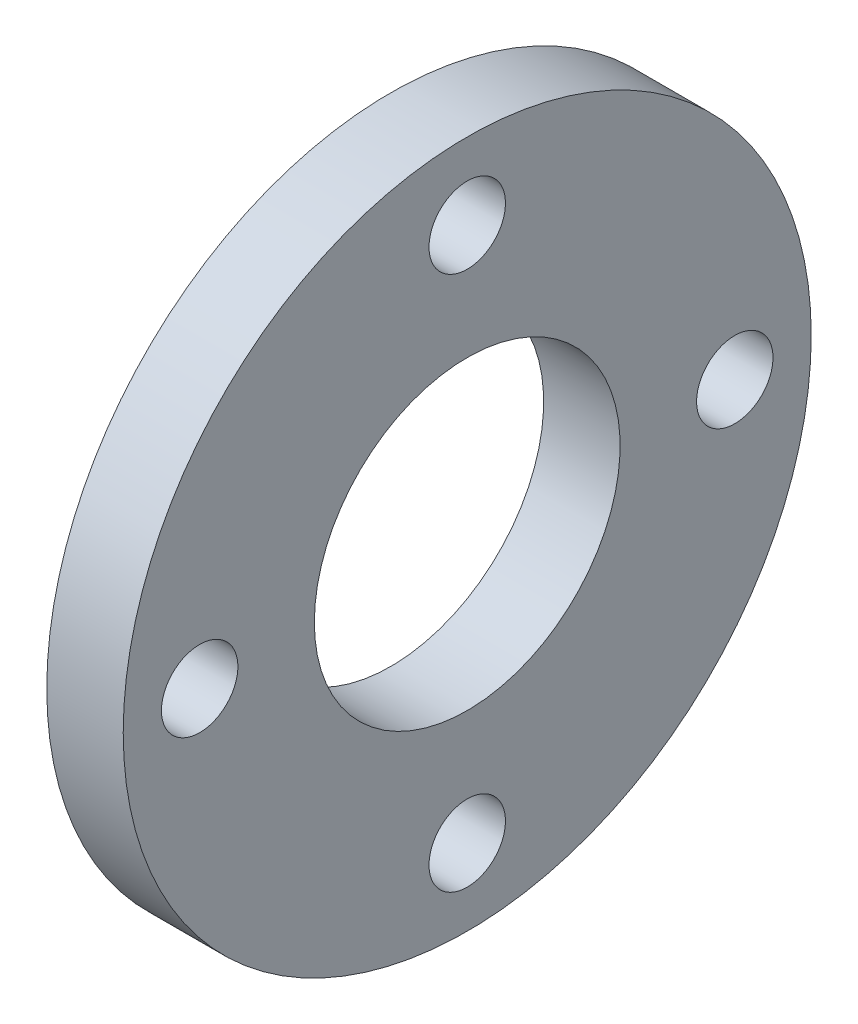
ISO-10303-21;
HEADER;
FILE_DESCRIPTION(('STEP AP214'),'2;1');
FILE_NAME('part.step','',(''),(''),'','','');
FILE_SCHEMA(('AUTOMOTIVE_DESIGN { 1 0 10303 214 1 1 1 1 }'));
ENDSEC;
DATA;
#1=APPLICATION_CONTEXT('core data for automotive mechanical design processes');
#2=APPLICATION_PROTOCOL_DEFINITION('international standard','automotive_design',2000,#1);
#3=PRODUCT_CONTEXT('',#1,'mechanical');
#4=PRODUCT('Part','Part','',(#3));
#5=PRODUCT_RELATED_PRODUCT_CATEGORY('part','',(#4));
#6=PRODUCT_DEFINITION_FORMATION('','',#4);
#7=PRODUCT_DEFINITION_CONTEXT('part definition',#1,'design');
#8=PRODUCT_DEFINITION('design','',#6,#7);
#9=PRODUCT_DEFINITION_SHAPE('','',#8);
#10=(LENGTH_UNIT() NAMED_UNIT(*) SI_UNIT(.MILLI.,.METRE.));
#11=(NAMED_UNIT(*) PLANE_ANGLE_UNIT() SI_UNIT($,.RADIAN.));
#12=(NAMED_UNIT(*) SI_UNIT($,.STERADIAN.) SOLID_ANGLE_UNIT());
#13=UNCERTAINTY_MEASURE_WITH_UNIT(LENGTH_MEASURE(1.E-05),#10,'distance_accuracy_value','');
#14=(GEOMETRIC_REPRESENTATION_CONTEXT(3) GLOBAL_UNCERTAINTY_ASSIGNED_CONTEXT((#13)) GLOBAL_UNIT_ASSIGNED_CONTEXT((#10,
#11,#12)) REPRESENTATION_CONTEXT('',''));
#15=CARTESIAN_POINT('',(0.,0.,0.));
#16=DIRECTION('',(0.,0.,1.));
#17=DIRECTION('',(1.,0.,0.));
#18=AXIS2_PLACEMENT_3D('',#15,#16,#17);
#19=CARTESIAN_POINT('',(26.9875000000025,186.931527045273,-3.20657300868764));
#20=DIRECTION('',(-1.,0.,0.));
#21=DIRECTION('',(0.,0.,1.));
#22=AXIS2_PLACEMENT_3D('',#19,#20,#21);
#23=PLANE('',#22);
#24=CARTESIAN_POINT('',(26.9875000000025,186.931527045273,-25.4315730086876));
#25=DIRECTION('',(-1.,0.,0.));
#26=DIRECTION('',(0.,0.,1.));
#27=AXIS2_PLACEMENT_3D('',#24,#25,#26);
#28=CIRCLE('',#27,3.175);
#29=CARTESIAN_POINT('',(26.9875000000025,186.931527045273,-22.2565730086876));
#30=VERTEX_POINT('',#29);
#31=EDGE_CURVE('E59',#30,#30,#28,.T.);
#32=ORIENTED_EDGE('',*,*,#31,.F.);
#33=EDGE_LOOP('',(#32));
#34=FACE_BOUND('',#33,.T.);
#35=CARTESIAN_POINT('',(26.9875000000025,186.931527045273,19.0184269913124));
#36=DIRECTION('',(-1.,0.,0.));
#37=DIRECTION('',(0.,0.,1.));
#38=AXIS2_PLACEMENT_3D('',#35,#36,#37);
#39=CIRCLE('',#38,3.175);
#40=CARTESIAN_POINT('',(26.9875000000025,186.931527045273,22.1934269913124));
#41=VERTEX_POINT('',#40);
#42=EDGE_CURVE('E47',#41,#41,#39,.T.);
#43=ORIENTED_EDGE('',*,*,#42,.F.);
#44=EDGE_LOOP('',(#43));
#45=FACE_BOUND('',#44,.T.);
#46=CARTESIAN_POINT('',(26.9875000000025,186.931527045273,-3.20657300868764));
#47=DIRECTION('',(-1.,0.,0.));
#48=DIRECTION('',(0.,0.,1.));
#49=AXIS2_PLACEMENT_3D('',#46,#47,#48);
#50=CIRCLE('',#49,28.575);
#51=CARTESIAN_POINT('',(26.9875000000025,186.931527045273,25.3684269913124));
#52=VERTEX_POINT('',#51);
#53=EDGE_CURVE('E10',#52,#52,#50,.T.);
#54=ORIENTED_EDGE('',*,*,#53,.T.);
#55=EDGE_LOOP('',(#54));
#56=FACE_BOUND('',#55,.T.);
#57=CARTESIAN_POINT('',(26.9875000000025,186.931527045273,-3.20657300868764));
#58=DIRECTION('',(-1.,0.,0.));
#59=DIRECTION('',(0.,0.,1.));
#60=AXIS2_PLACEMENT_3D('',#57,#58,#59);
#61=CIRCLE('',#60,12.7);
#62=CARTESIAN_POINT('',(26.9875000000025,186.931527045273,9.49342699131235));
#63=VERTEX_POINT('',#62);
#64=EDGE_CURVE('E42',#63,#63,#61,.T.);
#65=ORIENTED_EDGE('',*,*,#64,.F.);
#66=EDGE_LOOP('',(#65));
#67=FACE_BOUND('',#66,.T.);
#68=CARTESIAN_POINT('',(26.9875000000025,164.706527045273,-3.20657300868765));
#69=DIRECTION('',(-1.,0.,0.));
#70=DIRECTION('',(0.,0.,1.));
#71=AXIS2_PLACEMENT_3D('',#68,#69,#70);
#72=CIRCLE('',#71,3.175);
#73=CARTESIAN_POINT('',(26.9875000000025,164.706527045273,-0.031573008687653));
#74=VERTEX_POINT('',#73);
#75=EDGE_CURVE('E53',#74,#74,#72,.T.);
#76=ORIENTED_EDGE('',*,*,#75,.F.);
#77=EDGE_LOOP('',(#76));
#78=FACE_BOUND('',#77,.T.);
#79=CARTESIAN_POINT('',(26.9875000000025,209.156527045273,-3.20657300868763));
#80=DIRECTION('',(-1.,0.,0.));
#81=DIRECTION('',(0.,0.,1.));
#82=AXIS2_PLACEMENT_3D('',#79,#80,#81);
#83=CIRCLE('',#82,3.175);
#84=CARTESIAN_POINT('',(26.9875000000025,209.156527045273,-0.0315730086876348));
#85=VERTEX_POINT('',#84);
#86=EDGE_CURVE('E65',#85,#85,#83,.T.);
#87=ORIENTED_EDGE('',*,*,#86,.F.);
#88=EDGE_LOOP('',(#87));
#89=FACE_BOUND('',#88,.T.);
#90=ADVANCED_FACE('F31',(#34,#45,#56,#67,#78,#89),#23,.T.);
#91=CARTESIAN_POINT('',(33.3375000000025,186.931527045273,-3.20657300868764));
#92=DIRECTION('',(-1.,0.,0.));
#93=DIRECTION('',(0.,0.,1.));
#94=AXIS2_PLACEMENT_3D('',#91,#92,#93);
#95=PLANE('',#94);
#96=CARTESIAN_POINT('',(33.3375000000025,186.931527045273,-3.20657300868764));
#97=DIRECTION('',(-1.,0.,0.));
#98=DIRECTION('',(0.,0.,1.));
#99=AXIS2_PLACEMENT_3D('',#96,#97,#98);
#100=CIRCLE('',#99,28.575);
#101=CARTESIAN_POINT('',(33.3375000000025,186.931527045273,25.3684269913124));
#102=VERTEX_POINT('',#101);
#103=EDGE_CURVE('E35',#102,#102,#100,.T.);
#104=ORIENTED_EDGE('',*,*,#103,.F.);
#105=EDGE_LOOP('',(#104));
#106=FACE_BOUND('',#105,.T.);
#107=CARTESIAN_POINT('',(33.3375000000025,186.931527045273,-3.20657300868764));
#108=DIRECTION('',(-1.,0.,0.));
#109=DIRECTION('',(0.,0.,1.));
#110=AXIS2_PLACEMENT_3D('',#107,#108,#109);
#111=CIRCLE('',#110,12.7);
#112=CARTESIAN_POINT('',(33.3375000000025,186.931527045273,9.49342699131235));
#113=VERTEX_POINT('',#112);
#114=EDGE_CURVE('E44',#113,#113,#111,.T.);
#115=ORIENTED_EDGE('',*,*,#114,.T.);
#116=EDGE_LOOP('',(#115));
#117=FACE_BOUND('',#116,.T.);
#118=CARTESIAN_POINT('',(33.3375000000025,186.931527045273,19.0184269913124));
#119=DIRECTION('',(-1.,0.,0.));
#120=DIRECTION('',(0.,0.,1.));
#121=AXIS2_PLACEMENT_3D('',#118,#119,#120);
#122=CIRCLE('',#121,3.175);
#123=CARTESIAN_POINT('',(33.3375000000025,186.931527045273,22.1934269913124));
#124=VERTEX_POINT('',#123);
#125=EDGE_CURVE('E50',#124,#124,#122,.T.);
#126=ORIENTED_EDGE('',*,*,#125,.T.);
#127=EDGE_LOOP('',(#126));
#128=FACE_BOUND('',#127,.T.);
#129=CARTESIAN_POINT('',(33.3375000000025,164.706527045273,-3.20657300868765));
#130=DIRECTION('',(-1.,0.,0.));
#131=DIRECTION('',(0.,0.,1.));
#132=AXIS2_PLACEMENT_3D('',#129,#130,#131);
#133=CIRCLE('',#132,3.175);
#134=CARTESIAN_POINT('',(33.3375000000025,164.706527045273,-0.031573008687653));
#135=VERTEX_POINT('',#134);
#136=EDGE_CURVE('E56',#135,#135,#133,.T.);
#137=ORIENTED_EDGE('',*,*,#136,.T.);
#138=EDGE_LOOP('',(#137));
#139=FACE_BOUND('',#138,.T.);
#140=CARTESIAN_POINT('',(33.3375000000025,186.931527045273,-25.4315730086876));
#141=DIRECTION('',(-1.,0.,0.));
#142=DIRECTION('',(0.,0.,1.));
#143=AXIS2_PLACEMENT_3D('',#140,#141,#142);
#144=CIRCLE('',#143,3.175);
#145=CARTESIAN_POINT('',(33.3375000000025,186.931527045273,-22.2565730086876));
#146=VERTEX_POINT('',#145);
#147=EDGE_CURVE('E62',#146,#146,#144,.T.);
#148=ORIENTED_EDGE('',*,*,#147,.T.);
#149=EDGE_LOOP('',(#148));
#150=FACE_BOUND('',#149,.T.);
#151=CARTESIAN_POINT('',(33.3375000000025,209.156527045273,-3.20657300868763));
#152=DIRECTION('',(-1.,0.,0.));
#153=DIRECTION('',(0.,0.,1.));
#154=AXIS2_PLACEMENT_3D('',#151,#152,#153);
#155=CIRCLE('',#154,3.175);
#156=CARTESIAN_POINT('',(33.3375000000025,209.156527045273,-0.0315730086876348));
#157=VERTEX_POINT('',#156);
#158=EDGE_CURVE('E68',#157,#157,#155,.T.);
#159=ORIENTED_EDGE('',*,*,#158,.T.);
#160=EDGE_LOOP('',(#159));
#161=FACE_BOUND('',#160,.T.);
#162=ADVANCED_FACE('F78',(#106,#117,#128,#139,#150,#161),#95,.F.);
#163=CARTESIAN_POINT('',(26.9875000000025,186.931527045273,-3.20657300868764));
#164=DIRECTION('',(1.,0.,0.));
#165=DIRECTION('',(0.,0.,-1.));
#166=AXIS2_PLACEMENT_3D('',#163,#164,#165);
#167=CYLINDRICAL_SURFACE('',#166,28.575);
#168=ORIENTED_EDGE('',*,*,#53,.F.);
#169=EDGE_LOOP('',(#168));
#170=FACE_BOUND('',#169,.T.);
#171=ORIENTED_EDGE('',*,*,#103,.T.);
#172=EDGE_LOOP('',(#171));
#173=FACE_BOUND('',#172,.T.);
#174=ADVANCED_FACE('F33',(#170,#173),#167,.T.);
#175=CARTESIAN_POINT('',(26.9875000000025,186.931527045273,-3.20657300868764));
#176=DIRECTION('',(1.,0.,0.));
#177=DIRECTION('',(0.,0.,-1.));
#178=AXIS2_PLACEMENT_3D('',#175,#176,#177);
#179=CYLINDRICAL_SURFACE('',#178,12.7);
#180=ORIENTED_EDGE('',*,*,#64,.T.);
#181=EDGE_LOOP('',(#180));
#182=FACE_BOUND('',#181,.T.);
#183=ORIENTED_EDGE('',*,*,#114,.F.);
#184=EDGE_LOOP('',(#183));
#185=FACE_BOUND('',#184,.T.);
#186=ADVANCED_FACE('F88',(#182,#185),#179,.F.);
#187=CARTESIAN_POINT('',(26.9875000000025,186.931527045273,19.0184269913124));
#188=DIRECTION('',(1.,0.,0.));
#189=DIRECTION('',(0.,0.,-1.));
#190=AXIS2_PLACEMENT_3D('',#187,#188,#189);
#191=CYLINDRICAL_SURFACE('',#190,3.175);
#192=ORIENTED_EDGE('',*,*,#42,.T.);
#193=EDGE_LOOP('',(#192));
#194=FACE_BOUND('',#193,.T.);
#195=ORIENTED_EDGE('',*,*,#125,.F.);
#196=EDGE_LOOP('',(#195));
#197=FACE_BOUND('',#196,.T.);
#198=ADVANCED_FACE('F91',(#194,#197),#191,.F.);
#199=CARTESIAN_POINT('',(26.9875000000025,164.706527045273,-3.20657300868765));
#200=DIRECTION('',(1.,0.,0.));
#201=DIRECTION('',(0.,0.,-1.));
#202=AXIS2_PLACEMENT_3D('',#199,#200,#201);
#203=CYLINDRICAL_SURFACE('',#202,3.175);
#204=ORIENTED_EDGE('',*,*,#75,.T.);
#205=EDGE_LOOP('',(#204));
#206=FACE_BOUND('',#205,.T.);
#207=ORIENTED_EDGE('',*,*,#136,.F.);
#208=EDGE_LOOP('',(#207));
#209=FACE_BOUND('',#208,.T.);
#210=ADVANCED_FACE('F95',(#206,#209),#203,.F.);
#211=CARTESIAN_POINT('',(26.9875000000025,186.931527045273,-25.4315730086876));
#212=DIRECTION('',(1.,0.,0.));
#213=DIRECTION('',(0.,0.,-1.));
#214=AXIS2_PLACEMENT_3D('',#211,#212,#213);
#215=CYLINDRICAL_SURFACE('',#214,3.175);
#216=ORIENTED_EDGE('',*,*,#31,.T.);
#217=EDGE_LOOP('',(#216));
#218=FACE_BOUND('',#217,.T.);
#219=ORIENTED_EDGE('',*,*,#147,.F.);
#220=EDGE_LOOP('',(#219));
#221=FACE_BOUND('',#220,.T.);
#222=ADVANCED_FACE('F99',(#218,#221),#215,.F.);
#223=CARTESIAN_POINT('',(26.9875000000025,209.156527045273,-3.20657300868763));
#224=DIRECTION('',(1.,0.,0.));
#225=DIRECTION('',(0.,0.,-1.));
#226=AXIS2_PLACEMENT_3D('',#223,#224,#225);
#227=CYLINDRICAL_SURFACE('',#226,3.175);
#228=ORIENTED_EDGE('',*,*,#86,.T.);
#229=EDGE_LOOP('',(#228));
#230=FACE_BOUND('',#229,.T.);
#231=ORIENTED_EDGE('',*,*,#158,.F.);
#232=EDGE_LOOP('',(#231));
#233=FACE_BOUND('',#232,.T.);
#234=ADVANCED_FACE('F74',(#230,#233),#227,.F.);
#235=CLOSED_SHELL('',(#90,#162,#174,#186,#198,#210,#222,#234));
#236=MANIFOLD_SOLID_BREP('B2',#235);
#237=ADVANCED_BREP_SHAPE_REPRESENTATION('',(#18,#236),#14);
#238=SHAPE_DEFINITION_REPRESENTATION(#9,#237);
ENDSEC;
END-ISO-10303-21;
